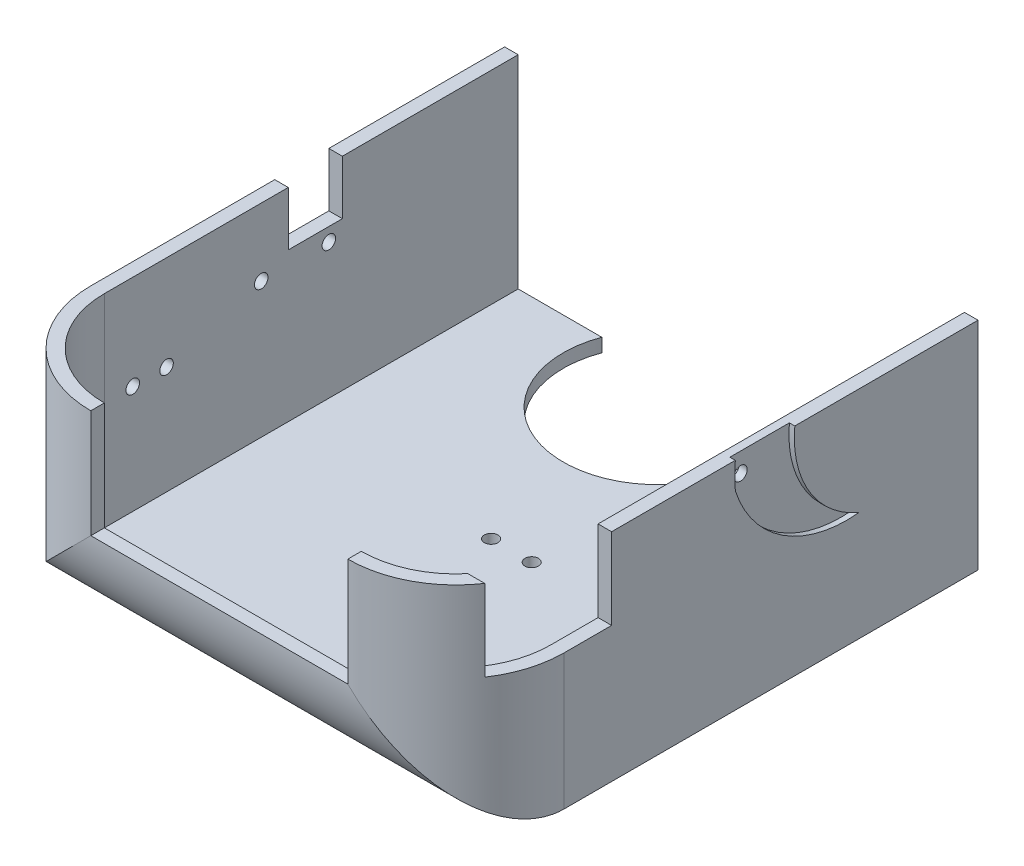
ISO-10303-21;
HEADER;
FILE_DESCRIPTION(('STEP AP214'),'2;1');
FILE_NAME('part.step','',(''),(''),'','','');
FILE_SCHEMA(('AUTOMOTIVE_DESIGN { 1 0 10303 214 1 1 1 1 }'));
ENDSEC;
DATA;
#1=APPLICATION_CONTEXT('core data for automotive mechanical design processes');
#2=APPLICATION_PROTOCOL_DEFINITION('international standard','automotive_design',2000,#1);
#3=PRODUCT_CONTEXT('',#1,'mechanical');
#4=PRODUCT('Part','Part','',(#3));
#5=PRODUCT_RELATED_PRODUCT_CATEGORY('part','',(#4));
#6=PRODUCT_DEFINITION_FORMATION('','',#4);
#7=PRODUCT_DEFINITION_CONTEXT('part definition',#1,'design');
#8=PRODUCT_DEFINITION('design','',#6,#7);
#9=PRODUCT_DEFINITION_SHAPE('','',#8);
#10=(LENGTH_UNIT() NAMED_UNIT(*) SI_UNIT(.MILLI.,.METRE.));
#11=(NAMED_UNIT(*) PLANE_ANGLE_UNIT() SI_UNIT($,.RADIAN.));
#12=(NAMED_UNIT(*) SI_UNIT($,.STERADIAN.) SOLID_ANGLE_UNIT());
#13=UNCERTAINTY_MEASURE_WITH_UNIT(LENGTH_MEASURE(1.E-05),#10,'distance_accuracy_value','');
#14=(GEOMETRIC_REPRESENTATION_CONTEXT(3) GLOBAL_UNCERTAINTY_ASSIGNED_CONTEXT((#13)) GLOBAL_UNIT_ASSIGNED_CONTEXT((#10,
#11,#12)) REPRESENTATION_CONTEXT('',''));
#15=CARTESIAN_POINT('',(0.,0.,0.));
#16=DIRECTION('',(0.,0.,1.));
#17=DIRECTION('',(1.,0.,0.));
#18=AXIS2_PLACEMENT_3D('',#15,#16,#17);
#19=CARTESIAN_POINT('',(0.,0.,0.));
#20=DIRECTION('',(0.,1.,0.));
#21=DIRECTION('',(0.,0.,1.));
#22=AXIS2_PLACEMENT_3D('',#19,#20,#21);
#23=PLANE('',#22);
#24=DIRECTION('',(-1.,0.,0.));
#25=VECTOR('',#24,1.);
#26=CARTESIAN_POINT('',(-82.5,0.,65.));
#27=LINE('',#26,#25);
#28=CARTESIAN_POINT('',(-82.5,0.,65.));
#29=VERTEX_POINT('',#28);
#30=CARTESIAN_POINT('',(-87.5,0.,65.));
#31=VERTEX_POINT('',#30);
#32=EDGE_CURVE('E289',#29,#31,#27,.T.);
#33=ORIENTED_EDGE('',*,*,#32,.F.);
#34=DIRECTION('',(0.,0.,1.));
#35=VECTOR('',#34,1.);
#36=CARTESIAN_POINT('',(-82.5,0.,193.));
#37=LINE('',#36,#35);
#38=CARTESIAN_POINT('',(-82.5,0.,0.));
#39=VERTEX_POINT('',#38);
#40=EDGE_CURVE('E355',#39,#29,#37,.T.);
#41=ORIENTED_EDGE('',*,*,#40,.F.);
#42=DIRECTION('',(-1.,0.,0.));
#43=VECTOR('',#42,1.);
#44=CARTESIAN_POINT('',(110.,0.,0.));
#45=LINE('',#44,#43);
#46=CARTESIAN_POINT('',(-87.5,0.,0.));
#47=VERTEX_POINT('',#46);
#48=EDGE_CURVE('E322',#39,#47,#45,.T.);
#49=ORIENTED_EDGE('',*,*,#48,.T.);
#50=DIRECTION('',(0.,0.,1.));
#51=VECTOR('',#50,1.);
#52=CARTESIAN_POINT('',(-87.5,0.,193.));
#53=LINE('',#52,#51);
#54=EDGE_CURVE('E362',#47,#31,#53,.T.);
#55=ORIENTED_EDGE('',*,*,#54,.T.);
#56=EDGE_LOOP('',(#33,#41,#49,#55));
#57=FACE_BOUND('',#56,.T.);
#58=ADVANCED_FACE('F45',(#57),#23,.T.);
#59=CARTESIAN_POINT('',(0.,0.,0.));
#60=DIRECTION('',(0.,0.,-1.));
#61=DIRECTION('',(-1.,0.,0.));
#62=AXIS2_PLACEMENT_3D('',#59,#60,#61);
#63=PLANE('',#62);
#64=DIRECTION('',(0.,-1.,0.));
#65=VECTOR('',#64,1.);
#66=CARTESIAN_POINT('',(-87.5,-80.,0.));
#67=LINE('',#66,#65);
#68=CARTESIAN_POINT('',(-87.5,-80.,0.));
#69=VERTEX_POINT('',#68);
#70=EDGE_CURVE('E434',#47,#69,#67,.T.);
#71=ORIENTED_EDGE('',*,*,#70,.F.);
#72=ORIENTED_EDGE('',*,*,#48,.F.);
#73=DIRECTION('',(0.,-1.,0.));
#74=VECTOR('',#73,1.);
#75=CARTESIAN_POINT('',(-82.5,0.,0.));
#76=LINE('',#75,#74);
#77=CARTESIAN_POINT('',(-82.5,-75.,0.));
#78=VERTEX_POINT('',#77);
#79=EDGE_CURVE('E426',#39,#78,#76,.T.);
#80=ORIENTED_EDGE('',*,*,#79,.T.);
#81=DIRECTION('',(1.,0.,0.));
#82=VECTOR('',#81,1.);
#83=CARTESIAN_POINT('',(0.,-75.,0.));
#84=LINE('',#83,#82);
#85=CARTESIAN_POINT('',(-51.5907616385491,-75.,0.));
#86=VERTEX_POINT('',#85);
#87=EDGE_CURVE('E403',#78,#86,#84,.T.);
#88=ORIENTED_EDGE('',*,*,#87,.T.);
#89=DIRECTION('',(0.,1.,0.));
#90=VECTOR('',#89,1.);
#91=CARTESIAN_POINT('',(-51.5907616385491,-80.,0.));
#92=LINE('',#91,#90);
#93=CARTESIAN_POINT('',(-51.5907616385491,-80.,0.));
#94=VERTEX_POINT('',#93);
#95=EDGE_CURVE('E387',#94,#86,#92,.T.);
#96=ORIENTED_EDGE('',*,*,#95,.F.);
#97=DIRECTION('',(1.,0.,0.));
#98=VECTOR('',#97,1.);
#99=CARTESIAN_POINT('',(-87.5,-80.,0.));
#100=LINE('',#99,#98);
#101=EDGE_CURVE('E438',#69,#94,#100,.T.);
#102=ORIENTED_EDGE('',*,*,#101,.F.);
#103=EDGE_LOOP('',(#71,#72,#80,#88,#96,#102));
#104=FACE_BOUND('',#103,.T.);
#105=ADVANCED_FACE('F565',(#104),#63,.T.);
#106=DIRECTION('',(0.,1.,0.));
#107=VECTOR('',#106,1.);
#108=CARTESIAN_POINT('',(82.5,0.,0.));
#109=LINE('',#108,#107);
#110=CARTESIAN_POINT('',(82.5,-75.,0.));
#111=VERTEX_POINT('',#110);
#112=CARTESIAN_POINT('',(82.5,0.,0.));
#113=VERTEX_POINT('',#112);
#114=EDGE_CURVE('E415',#111,#113,#109,.T.);
#115=ORIENTED_EDGE('',*,*,#114,.T.);
#116=CARTESIAN_POINT('',(87.5,0.,0.));
#117=VERTEX_POINT('',#116);
#118=EDGE_CURVE('E332',#117,#113,#45,.T.);
#119=ORIENTED_EDGE('',*,*,#118,.F.);
#120=DIRECTION('',(0.,1.,0.));
#121=VECTOR('',#120,1.);
#122=CARTESIAN_POINT('',(87.5,-80.,0.));
#123=LINE('',#122,#121);
#124=CARTESIAN_POINT('',(87.5,-80.,0.));
#125=VERTEX_POINT('',#124);
#126=EDGE_CURVE('E431',#125,#117,#123,.T.);
#127=ORIENTED_EDGE('',*,*,#126,.F.);
#128=CARTESIAN_POINT('',(14.0907616385492,-80.,0.));
#129=VERTEX_POINT('',#128);
#130=EDGE_CURVE('E437',#129,#125,#100,.T.);
#131=ORIENTED_EDGE('',*,*,#130,.F.);
#132=DIRECTION('',(0.,1.,0.));
#133=VECTOR('',#132,1.);
#134=CARTESIAN_POINT('',(14.0907616385492,-80.,0.));
#135=LINE('',#134,#133);
#136=CARTESIAN_POINT('',(14.0907616385492,-75.,0.));
#137=VERTEX_POINT('',#136);
#138=EDGE_CURVE('E385',#137,#129,#135,.F.);
#139=ORIENTED_EDGE('',*,*,#138,.F.);
#140=EDGE_CURVE('E429',#137,#111,#84,.T.);
#141=ORIENTED_EDGE('',*,*,#140,.T.);
#142=EDGE_LOOP('',(#115,#119,#127,#131,#139,#141));
#143=FACE_BOUND('',#142,.T.);
#144=ADVANCED_FACE('F513',(#143),#63,.T.);
#145=CARTESIAN_POINT('',(87.5,-80.,193.));
#146=DIRECTION('',(-1.,0.,0.));
#147=DIRECTION('',(0.,0.,1.));
#148=AXIS2_PLACEMENT_3D('',#145,#146,#147);
#149=PLANE('',#148);
#150=DIRECTION('',(0.,-0.999454897098666,-0.0330137647882723));
#151=VECTOR('',#150,1.);
#152=CARTESIAN_POINT('',(87.5,-4.77150670641982,89.8939941807223));
#153=LINE('',#152,#151);
#154=CARTESIAN_POINT('',(87.5,-4.77150670641982,89.8939941807223));
#155=VERTEX_POINT('',#154);
#156=CARTESIAN_POINT('',(87.5,-9.7715067064198,89.7288353282113));
#157=VERTEX_POINT('',#156);
#158=EDGE_CURVE('E258',#155,#157,#153,.T.);
#159=ORIENTED_EDGE('',*,*,#158,.F.);
#160=DIRECTION('',(0.,-0.999401488348817,0.0345928473267034));
#161=VECTOR('',#160,1.);
#162=CARTESIAN_POINT('',(87.5,0.,89.7288353282113));
#163=LINE('',#162,#161);
#164=CARTESIAN_POINT('',(87.5,0.,89.7288353282113));
#165=VERTEX_POINT('',#164);
#166=EDGE_CURVE('E230',#165,#155,#163,.T.);
#167=ORIENTED_EDGE('',*,*,#166,.F.);
#168=DIRECTION('',(0.,0.,-1.));
#169=VECTOR('',#168,1.);
#170=CARTESIAN_POINT('',(87.5,0.,193.));
#171=LINE('',#170,#169);
#172=CARTESIAN_POINT('',(87.5,0.,135.457670656423));
#173=VERTEX_POINT('',#172);
#174=EDGE_CURVE('E346',#173,#165,#171,.T.);
#175=ORIENTED_EDGE('',*,*,#174,.F.);
#176=DIRECTION('',(0.,-1.,0.));
#177=VECTOR('',#176,1.);
#178=CARTESIAN_POINT('',(87.5,-80.,135.457670656423));
#179=LINE('',#178,#177);
#180=CARTESIAN_POINT('',(87.5,-30.,135.457670656423));
#181=VERTEX_POINT('',#180);
#182=EDGE_CURVE('E380',#173,#181,#179,.T.);
#183=ORIENTED_EDGE('',*,*,#182,.T.);
#184=DIRECTION('',(0.,0.,1.));
#185=VECTOR('',#184,1.);
#186=CARTESIAN_POINT('',(87.5,-30.,193.));
#187=LINE('',#186,#185);
#188=CARTESIAN_POINT('',(87.5,-30.,153.));
#189=VERTEX_POINT('',#188);
#190=EDGE_CURVE('E375',#181,#189,#187,.T.);
#191=ORIENTED_EDGE('',*,*,#190,.T.);
#192=DIRECTION('',(0.,1.,0.));
#193=VECTOR('',#192,1.);
#194=CARTESIAN_POINT('',(87.5,-80.,153.));
#195=LINE('',#194,#193);
#196=CARTESIAN_POINT('',(87.5,-80.,153.));
#197=VERTEX_POINT('',#196);
#198=EDGE_CURVE('E458',#189,#197,#195,.F.);
#199=ORIENTED_EDGE('',*,*,#198,.T.);
#200=DIRECTION('',(0.,0.,-1.));
#201=VECTOR('',#200,1.);
#202=CARTESIAN_POINT('',(87.5,-80.,193.));
#203=LINE('',#202,#201);
#204=EDGE_CURVE('E441',#197,#125,#203,.T.);
#205=ORIENTED_EDGE('',*,*,#204,.T.);
#206=ORIENTED_EDGE('',*,*,#126,.T.);
#207=CARTESIAN_POINT('',(87.5,0.,67.7288353282113));
#208=VERTEX_POINT('',#207);
#209=EDGE_CURVE('E345',#208,#117,#171,.T.);
#210=ORIENTED_EDGE('',*,*,#209,.F.);
#211=CARTESIAN_POINT('',(87.5,-3.71907040689845,29.0884792625893));
#212=DIRECTION('',(-1.,0.,0.));
#213=DIRECTION('',(0.,0.,-1.));
#214=AXIS2_PLACEMENT_3D('',#211,#212,#213);
#215=CIRCLE('',#214,38.8189206646645);
#216=CARTESIAN_POINT('',(87.5,-39.5692118956316,43.977265539762));
#217=VERTEX_POINT('',#216);
#218=EDGE_CURVE('E246',#217,#208,#215,.T.);
#219=ORIENTED_EDGE('',*,*,#218,.F.);
#220=CARTESIAN_POINT('',(87.5,3.43317957033893,48.5493950635888));
#221=DIRECTION('',(1.,0.,0.));
#222=DIRECTION('',(0.,0.,-1.));
#223=AXIS2_PLACEMENT_3D('',#220,#221,#222);
#224=CIRCLE('',#223,43.2447689342333);
#225=EDGE_CURVE('E248',#157,#217,#224,.T.);
#226=ORIENTED_EDGE('',*,*,#225,.F.);
#227=EDGE_LOOP('',(#159,#167,#175,#183,#191,#199,#205,#206,#210,#219,#226));
#228=FACE_BOUND('',#227,.T.);
#229=ADVANCED_FACE('F506',(#228),#149,.F.);
#230=CARTESIAN_POINT('',(-87.5,-80.,193.));
#231=DIRECTION('',(1.,0.,0.));
#232=DIRECTION('',(0.,0.,-1.));
#233=AXIS2_PLACEMENT_3D('',#230,#231,#232);
#234=PLANE('',#233);
#235=CARTESIAN_POINT('',(-87.5,-35.,130.));
#236=DIRECTION('',(-1.,0.,0.));
#237=DIRECTION('',(0.,0.,1.));
#238=AXIS2_PLACEMENT_3D('',#235,#236,#237);
#239=CIRCLE('',#238,2.5);
#240=CARTESIAN_POINT('',(-87.5,-35.,132.5));
#241=VERTEX_POINT('',#240);
#242=EDGE_CURVE('E285',#241,#241,#239,.T.);
#243=ORIENTED_EDGE('',*,*,#242,.F.);
#244=EDGE_LOOP('',(#243));
#245=FACE_BOUND('',#244,.T.);
#246=CARTESIAN_POINT('',(-87.5,-35.,142.5));
#247=DIRECTION('',(-1.,0.,0.));
#248=DIRECTION('',(0.,0.,1.));
#249=AXIS2_PLACEMENT_3D('',#246,#247,#248);
#250=CIRCLE('',#249,2.5);
#251=CARTESIAN_POINT('',(-87.5,-35.,145.));
#252=VERTEX_POINT('',#251);
#253=EDGE_CURVE('E302',#252,#252,#250,.T.);
#254=ORIENTED_EDGE('',*,*,#253,.F.);
#255=EDGE_LOOP('',(#254));
#256=FACE_BOUND('',#255,.T.);
#257=CARTESIAN_POINT('',(-87.5,-25.,70.));
#258=DIRECTION('',(-1.,0.,0.));
#259=DIRECTION('',(0.,0.,1.));
#260=AXIS2_PLACEMENT_3D('',#257,#258,#259);
#261=CIRCLE('',#260,2.5);
#262=CARTESIAN_POINT('',(-87.5,-25.,72.5));
#263=VERTEX_POINT('',#262);
#264=EDGE_CURVE('E308',#263,#263,#261,.T.);
#265=ORIENTED_EDGE('',*,*,#264,.F.);
#266=EDGE_LOOP('',(#265));
#267=FACE_BOUND('',#266,.T.);
#268=CARTESIAN_POINT('',(-87.5,-25.,95.));
#269=DIRECTION('',(-1.,0.,0.));
#270=DIRECTION('',(0.,0.,1.));
#271=AXIS2_PLACEMENT_3D('',#268,#269,#270);
#272=CIRCLE('',#271,2.5);
#273=CARTESIAN_POINT('',(-87.5,-25.,97.5));
#274=VERTEX_POINT('',#273);
#275=EDGE_CURVE('E314',#274,#274,#272,.T.);
#276=ORIENTED_EDGE('',*,*,#275,.F.);
#277=EDGE_LOOP('',(#276));
#278=FACE_BOUND('',#277,.T.);
#279=DIRECTION('',(0.,0.,1.));
#280=VECTOR('',#279,1.);
#281=CARTESIAN_POINT('',(-87.5,-20.,65.));
#282=LINE('',#281,#280);
#283=CARTESIAN_POINT('',(-87.5,-20.,65.));
#284=VERTEX_POINT('',#283);
#285=CARTESIAN_POINT('',(-87.5,-20.,85.));
#286=VERTEX_POINT('',#285);
#287=EDGE_CURVE('E284',#284,#286,#282,.T.);
#288=ORIENTED_EDGE('',*,*,#287,.F.);
#289=DIRECTION('',(0.,-1.,0.));
#290=VECTOR('',#289,1.);
#291=CARTESIAN_POINT('',(-87.5,0.,65.));
#292=LINE('',#291,#290);
#293=EDGE_CURVE('E281',#31,#284,#292,.T.);
#294=ORIENTED_EDGE('',*,*,#293,.F.);
#295=ORIENTED_EDGE('',*,*,#54,.F.);
#296=ORIENTED_EDGE('',*,*,#70,.T.);
#297=DIRECTION('',(0.,0.,-1.));
#298=VECTOR('',#297,1.);
#299=CARTESIAN_POINT('',(-87.5,-80.,193.));
#300=LINE('',#299,#298);
#301=CARTESIAN_POINT('',(-87.5,-80.,153.));
#302=VERTEX_POINT('',#301);
#303=EDGE_CURVE('E444',#302,#69,#300,.T.);
#304=ORIENTED_EDGE('',*,*,#303,.F.);
#305=DIRECTION('',(0.,-1.,0.));
#306=VECTOR('',#305,1.);
#307=CARTESIAN_POINT('',(-87.5,-80.,153.));
#308=LINE('',#307,#306);
#309=CARTESIAN_POINT('',(-87.5,0.,153.));
#310=VERTEX_POINT('',#309);
#311=EDGE_CURVE('E460',#302,#310,#308,.F.);
#312=ORIENTED_EDGE('',*,*,#311,.T.);
#313=CARTESIAN_POINT('',(-87.5,0.,85.));
#314=VERTEX_POINT('',#313);
#315=EDGE_CURVE('E361',#314,#310,#53,.T.);
#316=ORIENTED_EDGE('',*,*,#315,.F.);
#317=DIRECTION('',(0.,1.,0.));
#318=VECTOR('',#317,1.);
#319=CARTESIAN_POINT('',(-87.5,0.,85.));
#320=LINE('',#319,#318);
#321=EDGE_CURVE('E68',#286,#314,#320,.T.);
#322=ORIENTED_EDGE('',*,*,#321,.F.);
#323=EDGE_LOOP('',(#288,#294,#295,#296,#304,#312,#316,#322));
#324=FACE_BOUND('',#323,.T.);
#325=ADVANCED_FACE('F589',(#245,#256,#267,#278,#324),#234,.F.);
#326=CARTESIAN_POINT('',(-47.5,0.,153.));
#327=DIRECTION('',(0.,-1.,0.));
#328=DIRECTION('',(0.,0.,-1.));
#329=AXIS2_PLACEMENT_3D('',#326,#327,#328);
#330=CYLINDRICAL_SURFACE('',#329,40.);
#331=DIRECTION('',(0.,-1.,0.));
#332=VECTOR('',#331,1.);
#333=CARTESIAN_POINT('',(-47.5,0.,193.));
#334=LINE('',#333,#332);
#335=CARTESIAN_POINT('',(-47.5,0.,193.));
#336=VERTEX_POINT('',#335);
#337=CARTESIAN_POINT('',(-47.5,-40.,193.));
#338=VERTEX_POINT('',#337);
#339=EDGE_CURVE('E447',#336,#338,#334,.T.);
#340=ORIENTED_EDGE('',*,*,#339,.F.);
#341=CARTESIAN_POINT('',(-47.5,0.,153.));
#342=DIRECTION('',(0.,1.,0.));
#343=DIRECTION('',(0.,0.,1.));
#344=AXIS2_PLACEMENT_3D('',#341,#342,#343);
#345=CIRCLE('',#344,40.);
#346=EDGE_CURVE('E358',#336,#310,#345,.F.);
#347=ORIENTED_EDGE('',*,*,#346,.T.);
#348=ORIENTED_EDGE('',*,*,#311,.F.);
#349=CARTESIAN_POINT('',(-47.5,-40.,153.));
#350=DIRECTION('',(0.707106781186547,-0.707106781186547,0.));
#351=DIRECTION('',(-0.707106781186547,-0.707106781186547,0.));
#352=AXIS2_PLACEMENT_3D('',#349,#350,#351);
#353=ELLIPSE('',#352,56.5685424949238,40.);
#354=EDGE_CURVE('E435',#338,#302,#353,.T.);
#355=ORIENTED_EDGE('',*,*,#354,.F.);
#356=EDGE_LOOP('',(#340,#347,#348,#355));
#357=FACE_BOUND('',#356,.T.);
#358=ADVANCED_FACE('F47',(#357),#330,.T.);
#359=CARTESIAN_POINT('',(47.5,0.,153.));
#360=DIRECTION('',(0.,1.,0.));
#361=DIRECTION('',(0.,0.,1.));
#362=AXIS2_PLACEMENT_3D('',#359,#360,#361);
#363=CYLINDRICAL_SURFACE('',#362,40.);
#364=DIRECTION('',(0.,1.,0.));
#365=VECTOR('',#364,1.);
#366=CARTESIAN_POINT('',(80.6006499737944,0.,175.457670656423));
#367=LINE('',#366,#365);
#368=CARTESIAN_POINT('',(80.6006499737944,0.,175.457670656423));
#369=VERTEX_POINT('',#368);
#370=CARTESIAN_POINT('',(80.6006499737944,-30.,175.457670656423));
#371=VERTEX_POINT('',#370);
#372=EDGE_CURVE('E378',#369,#371,#367,.F.);
#373=ORIENTED_EDGE('',*,*,#372,.F.);
#374=CARTESIAN_POINT('',(47.5,0.,153.));
#375=DIRECTION('',(0.,1.,0.));
#376=DIRECTION('',(0.,0.,1.));
#377=AXIS2_PLACEMENT_3D('',#374,#375,#376);
#378=CIRCLE('',#377,40.);
#379=CARTESIAN_POINT('',(47.5,0.,193.));
#380=VERTEX_POINT('',#379);
#381=EDGE_CURVE('E335',#369,#380,#378,.F.);
#382=ORIENTED_EDGE('',*,*,#381,.T.);
#383=DIRECTION('',(0.,1.,0.));
#384=VECTOR('',#383,1.);
#385=CARTESIAN_POINT('',(47.5,0.,193.));
#386=LINE('',#385,#384);
#387=CARTESIAN_POINT('',(47.5,-40.,193.));
#388=VERTEX_POINT('',#387);
#389=EDGE_CURVE('E449',#388,#380,#386,.T.);
#390=ORIENTED_EDGE('',*,*,#389,.F.);
#391=CARTESIAN_POINT('',(47.5,-40.,153.));
#392=DIRECTION('',(0.707106781186547,0.707106781186547,0.));
#393=DIRECTION('',(-0.707106781186547,0.707106781186547,0.));
#394=AXIS2_PLACEMENT_3D('',#391,#392,#393);
#395=ELLIPSE('',#394,56.5685424949238,40.);
#396=EDGE_CURVE('E409',#197,#388,#395,.F.);
#397=ORIENTED_EDGE('',*,*,#396,.F.);
#398=ORIENTED_EDGE('',*,*,#198,.F.);
#399=CARTESIAN_POINT('',(47.5,-30.,153.));
#400=DIRECTION('',(0.,-1.,0.));
#401=DIRECTION('',(0.,0.,-1.));
#402=AXIS2_PLACEMENT_3D('',#399,#400,#401);
#403=CIRCLE('',#402,40.);
#404=EDGE_CURVE('E373',#371,#189,#403,.F.);
#405=ORIENTED_EDGE('',*,*,#404,.F.);
#406=EDGE_LOOP('',(#373,#382,#390,#397,#398,#405));
#407=FACE_BOUND('',#406,.T.);
#408=ADVANCED_FACE('F501',(#407),#363,.T.);
#409=CARTESIAN_POINT('',(82.5,-80.,193.));
#410=DIRECTION('',(-1.,0.,0.));
#411=DIRECTION('',(0.,0.,1.));
#412=AXIS2_PLACEMENT_3D('',#409,#410,#411);
#413=PLANE('',#412);
#414=CARTESIAN_POINT('',(82.5,-7.13937962441099,85.8114147544668));
#415=DIRECTION('',(-1.,0.,0.));
#416=DIRECTION('',(0.,0.,1.));
#417=AXIS2_PLACEMENT_3D('',#414,#415,#416);
#418=CIRCLE('',#417,2.5);
#419=CARTESIAN_POINT('',(82.5,-7.13937962441099,88.3114147544668));
#420=VERTEX_POINT('',#419);
#421=EDGE_CURVE('E251',#420,#420,#418,.T.);
#422=ORIENTED_EDGE('',*,*,#421,.F.);
#423=EDGE_LOOP('',(#422));
#424=FACE_BOUND('',#423,.T.);
#425=DIRECTION('',(0.,-1.,0.));
#426=VECTOR('',#425,1.);
#427=CARTESIAN_POINT('',(82.5,-80.,135.457670656423));
#428=LINE('',#427,#426);
#429=CARTESIAN_POINT('',(82.5,0.,135.457670656423));
#430=VERTEX_POINT('',#429);
#431=CARTESIAN_POINT('',(82.5,-30.,135.457670656423));
#432=VERTEX_POINT('',#431);
#433=EDGE_CURVE('E53',#430,#432,#428,.T.);
#434=ORIENTED_EDGE('',*,*,#433,.F.);
#435=DIRECTION('',(0.,0.,-1.));
#436=VECTOR('',#435,1.);
#437=CARTESIAN_POINT('',(82.5,0.,193.));
#438=LINE('',#437,#436);
#439=EDGE_CURVE('E342',#430,#113,#438,.T.);
#440=ORIENTED_EDGE('',*,*,#439,.T.);
#441=ORIENTED_EDGE('',*,*,#114,.F.);
#442=DIRECTION('',(0.,0.,-1.));
#443=VECTOR('',#442,1.);
#444=CARTESIAN_POINT('',(82.5,-75.,193.));
#445=LINE('',#444,#443);
#446=CARTESIAN_POINT('',(82.5,-75.,153.));
#447=VERTEX_POINT('',#446);
#448=EDGE_CURVE('E399',#447,#111,#445,.T.);
#449=ORIENTED_EDGE('',*,*,#448,.F.);
#450=DIRECTION('',(0.,1.,0.));
#451=VECTOR('',#450,1.);
#452=CARTESIAN_POINT('',(82.5,-80.,153.));
#453=LINE('',#452,#451);
#454=CARTESIAN_POINT('',(82.5,-30.,153.));
#455=VERTEX_POINT('',#454);
#456=EDGE_CURVE('E395',#455,#447,#453,.F.);
#457=ORIENTED_EDGE('',*,*,#456,.F.);
#458=DIRECTION('',(0.,0.,1.));
#459=VECTOR('',#458,1.);
#460=CARTESIAN_POINT('',(82.5,-30.,193.));
#461=LINE('',#460,#459);
#462=EDGE_CURVE('E369',#432,#455,#461,.T.);
#463=ORIENTED_EDGE('',*,*,#462,.F.);
#464=EDGE_LOOP('',(#434,#440,#441,#449,#457,#463));
#465=FACE_BOUND('',#464,.T.);
#466=ADVANCED_FACE('F485',(#424,#465),#413,.T.);
#467=CARTESIAN_POINT('',(-82.5,-80.,193.));
#468=DIRECTION('',(1.,0.,0.));
#469=DIRECTION('',(0.,0.,-1.));
#470=AXIS2_PLACEMENT_3D('',#467,#468,#469);
#471=PLANE('',#470);
#472=DIRECTION('',(0.,-1.,0.));
#473=VECTOR('',#472,1.);
#474=CARTESIAN_POINT('',(-82.5,0.,65.));
#475=LINE('',#474,#473);
#476=CARTESIAN_POINT('',(-82.5,-20.,65.));
#477=VERTEX_POINT('',#476);
#478=EDGE_CURVE('E271',#29,#477,#475,.T.);
#479=ORIENTED_EDGE('',*,*,#478,.T.);
#480=DIRECTION('',(0.,0.,1.));
#481=VECTOR('',#480,1.);
#482=CARTESIAN_POINT('',(-82.5,-20.,65.));
#483=LINE('',#482,#481);
#484=CARTESIAN_POINT('',(-82.5,-20.,85.));
#485=VERTEX_POINT('',#484);
#486=EDGE_CURVE('E274',#477,#485,#483,.T.);
#487=ORIENTED_EDGE('',*,*,#486,.T.);
#488=DIRECTION('',(0.,1.,0.));
#489=VECTOR('',#488,1.);
#490=CARTESIAN_POINT('',(-82.5,0.,85.));
#491=LINE('',#490,#489);
#492=CARTESIAN_POINT('',(-82.5,0.,85.));
#493=VERTEX_POINT('',#492);
#494=EDGE_CURVE('E277',#485,#493,#491,.T.);
#495=ORIENTED_EDGE('',*,*,#494,.T.);
#496=CARTESIAN_POINT('',(-82.5,0.,153.));
#497=VERTEX_POINT('',#496);
#498=EDGE_CURVE('E354',#493,#497,#37,.T.);
#499=ORIENTED_EDGE('',*,*,#498,.T.);
#500=DIRECTION('',(0.,1.,0.));
#501=VECTOR('',#500,1.);
#502=CARTESIAN_POINT('',(-82.5,-80.,153.));
#503=LINE('',#502,#501);
#504=CARTESIAN_POINT('',(-82.5,-75.,153.));
#505=VERTEX_POINT('',#504);
#506=EDGE_CURVE('E397',#505,#497,#503,.T.);
#507=ORIENTED_EDGE('',*,*,#506,.F.);
#508=DIRECTION('',(0.,0.,-1.));
#509=VECTOR('',#508,1.);
#510=CARTESIAN_POINT('',(-82.5,-75.,193.));
#511=LINE('',#510,#509);
#512=EDGE_CURVE('E402',#505,#78,#511,.T.);
#513=ORIENTED_EDGE('',*,*,#512,.T.);
#514=ORIENTED_EDGE('',*,*,#79,.F.);
#515=ORIENTED_EDGE('',*,*,#40,.T.);
#516=EDGE_LOOP('',(#479,#487,#495,#499,#507,#513,#514,#515));
#517=FACE_BOUND('',#516,.T.);
#518=CARTESIAN_POINT('',(-82.5,-35.,130.));
#519=DIRECTION('',(-1.,0.,0.));
#520=DIRECTION('',(0.,0.,1.));
#521=AXIS2_PLACEMENT_3D('',#518,#519,#520);
#522=CIRCLE('',#521,2.5);
#523=CARTESIAN_POINT('',(-82.5,-35.,132.5));
#524=VERTEX_POINT('',#523);
#525=EDGE_CURVE('E299',#524,#524,#522,.T.);
#526=ORIENTED_EDGE('',*,*,#525,.T.);
#527=EDGE_LOOP('',(#526));
#528=FACE_BOUND('',#527,.T.);
#529=CARTESIAN_POINT('',(-82.5,-35.,142.5));
#530=DIRECTION('',(-1.,0.,0.));
#531=DIRECTION('',(0.,0.,1.));
#532=AXIS2_PLACEMENT_3D('',#529,#530,#531);
#533=CIRCLE('',#532,2.5);
#534=CARTESIAN_POINT('',(-82.5,-35.,145.));
#535=VERTEX_POINT('',#534);
#536=EDGE_CURVE('E305',#535,#535,#533,.T.);
#537=ORIENTED_EDGE('',*,*,#536,.T.);
#538=EDGE_LOOP('',(#537));
#539=FACE_BOUND('',#538,.T.);
#540=CARTESIAN_POINT('',(-82.5,-25.,70.));
#541=DIRECTION('',(-1.,0.,0.));
#542=DIRECTION('',(0.,0.,1.));
#543=AXIS2_PLACEMENT_3D('',#540,#541,#542);
#544=CIRCLE('',#543,2.5);
#545=CARTESIAN_POINT('',(-82.5,-25.,72.5));
#546=VERTEX_POINT('',#545);
#547=EDGE_CURVE('E311',#546,#546,#544,.T.);
#548=ORIENTED_EDGE('',*,*,#547,.T.);
#549=EDGE_LOOP('',(#548));
#550=FACE_BOUND('',#549,.T.);
#551=CARTESIAN_POINT('',(-82.5,-25.,95.));
#552=DIRECTION('',(-1.,0.,0.));
#553=DIRECTION('',(0.,0.,1.));
#554=AXIS2_PLACEMENT_3D('',#551,#552,#553);
#555=CIRCLE('',#554,2.5);
#556=CARTESIAN_POINT('',(-82.5,-25.,97.5));
#557=VERTEX_POINT('',#556);
#558=EDGE_CURVE('E264',#557,#557,#555,.T.);
#559=ORIENTED_EDGE('',*,*,#558,.T.);
#560=EDGE_LOOP('',(#559));
#561=FACE_BOUND('',#560,.T.);
#562=ADVANCED_FACE('F581',(#517,#528,#539,#550,#561),#471,.T.);
#563=CARTESIAN_POINT('',(-47.5,0.,153.));
#564=DIRECTION('',(0.,-1.,0.));
#565=DIRECTION('',(0.,0.,-1.));
#566=AXIS2_PLACEMENT_3D('',#563,#564,#565);
#567=CYLINDRICAL_SURFACE('',#566,35.);
#568=CARTESIAN_POINT('',(-47.5,0.,153.));
#569=DIRECTION('',(0.,1.,0.));
#570=DIRECTION('',(0.,0.,1.));
#571=AXIS2_PLACEMENT_3D('',#568,#569,#570);
#572=CIRCLE('',#571,35.);
#573=CARTESIAN_POINT('',(-47.5,0.,188.));
#574=VERTEX_POINT('',#573);
#575=EDGE_CURVE('E351',#574,#497,#572,.F.);
#576=ORIENTED_EDGE('',*,*,#575,.F.);
#577=DIRECTION('',(0.,1.,0.));
#578=VECTOR('',#577,1.);
#579=CARTESIAN_POINT('',(-47.5,0.,188.));
#580=LINE('',#579,#578);
#581=CARTESIAN_POINT('',(-47.5,-40.,188.));
#582=VERTEX_POINT('',#581);
#583=EDGE_CURVE('E406',#574,#582,#580,.F.);
#584=ORIENTED_EDGE('',*,*,#583,.T.);
#585=CARTESIAN_POINT('',(-47.5,-40.,153.));
#586=DIRECTION('',(0.707106781186547,-0.707106781186547,0.));
#587=DIRECTION('',(0.707106781186547,0.707106781186547,0.));
#588=AXIS2_PLACEMENT_3D('',#585,#586,#587);
#589=ELLIPSE('',#588,49.4974746830583,35.);
#590=EDGE_CURVE('E413',#582,#505,#589,.T.);
#591=ORIENTED_EDGE('',*,*,#590,.T.);
#592=ORIENTED_EDGE('',*,*,#506,.T.);
#593=EDGE_LOOP('',(#576,#584,#591,#592));
#594=FACE_BOUND('',#593,.T.);
#595=ADVANCED_FACE('F600',(#594),#567,.F.);
#596=CARTESIAN_POINT('',(47.5,0.,153.));
#597=DIRECTION('',(0.,1.,0.));
#598=DIRECTION('',(0.,0.,1.));
#599=AXIS2_PLACEMENT_3D('',#596,#597,#598);
#600=CYLINDRICAL_SURFACE('',#599,35.);
#601=CARTESIAN_POINT('',(47.5,0.,153.));
#602=DIRECTION('',(0.,1.,0.));
#603=DIRECTION('',(0.,0.,1.));
#604=AXIS2_PLACEMENT_3D('',#601,#602,#603);
#605=CIRCLE('',#604,35.);
#606=CARTESIAN_POINT('',(74.3449814432355,0.,175.457670656423));
#607=VERTEX_POINT('',#606);
#608=CARTESIAN_POINT('',(47.5,0.,188.));
#609=VERTEX_POINT('',#608);
#610=EDGE_CURVE('E333',#607,#609,#605,.F.);
#611=ORIENTED_EDGE('',*,*,#610,.F.);
#612=DIRECTION('',(0.,1.,0.));
#613=VECTOR('',#612,1.);
#614=CARTESIAN_POINT('',(74.3449814432355,0.,175.457670656423));
#615=LINE('',#614,#613);
#616=CARTESIAN_POINT('',(74.3449814432355,-30.,175.457670656423));
#617=VERTEX_POINT('',#616);
#618=EDGE_CURVE('E471',#607,#617,#615,.F.);
#619=ORIENTED_EDGE('',*,*,#618,.T.);
#620=CARTESIAN_POINT('',(47.5,-30.,153.));
#621=DIRECTION('',(0.,-1.,0.));
#622=DIRECTION('',(0.,0.,-1.));
#623=AXIS2_PLACEMENT_3D('',#620,#621,#622);
#624=CIRCLE('',#623,35.);
#625=EDGE_CURVE('E468',#617,#455,#624,.F.);
#626=ORIENTED_EDGE('',*,*,#625,.T.);
#627=ORIENTED_EDGE('',*,*,#456,.T.);
#628=CARTESIAN_POINT('',(47.5,-40.,153.));
#629=DIRECTION('',(0.707106781186547,0.707106781186547,0.));
#630=DIRECTION('',(0.707106781186547,-0.707106781186547,0.));
#631=AXIS2_PLACEMENT_3D('',#628,#629,#630);
#632=ELLIPSE('',#631,49.4974746830583,35.);
#633=CARTESIAN_POINT('',(47.5,-40.,188.));
#634=VERTEX_POINT('',#633);
#635=EDGE_CURVE('E392',#447,#634,#632,.F.);
#636=ORIENTED_EDGE('',*,*,#635,.T.);
#637=DIRECTION('',(0.,1.,0.));
#638=VECTOR('',#637,1.);
#639=CARTESIAN_POINT('',(47.5,0.,188.));
#640=LINE('',#639,#638);
#641=EDGE_CURVE('E417',#634,#609,#640,.T.);
#642=ORIENTED_EDGE('',*,*,#641,.T.);
#643=EDGE_LOOP('',(#611,#619,#626,#627,#636,#642));
#644=FACE_BOUND('',#643,.T.);
#645=ADVANCED_FACE('F491',(#644),#600,.F.);
#646=CARTESIAN_POINT('',(-47.5,40.,183.));
#647=DIRECTION('',(-1.,0.,0.));
#648=DIRECTION('',(0.,-1.,0.));
#649=AXIS2_PLACEMENT_3D('',#646,#647,#648);
#650=PLANE('',#649);
#651=DIRECTION('',(0.,0.,-1.));
#652=VECTOR('',#651,1.);
#653=CARTESIAN_POINT('',(-47.5,0.,183.));
#654=LINE('',#653,#652);
#655=EDGE_CURVE('E349',#336,#574,#654,.T.);
#656=ORIENTED_EDGE('',*,*,#655,.F.);
#657=ORIENTED_EDGE('',*,*,#339,.T.);
#658=DIRECTION('',(0.,0.,1.));
#659=VECTOR('',#658,1.);
#660=CARTESIAN_POINT('',(-47.5,-40.,183.));
#661=LINE('',#660,#659);
#662=EDGE_CURVE('E389',#582,#338,#661,.T.);
#663=ORIENTED_EDGE('',*,*,#662,.F.);
#664=ORIENTED_EDGE('',*,*,#583,.F.);
#665=EDGE_LOOP('',(#656,#657,#663,#664));
#666=FACE_BOUND('',#665,.T.);
#667=ADVANCED_FACE('F535',(#666),#650,.F.);
#668=CARTESIAN_POINT('',(47.5,40.,183.));
#669=DIRECTION('',(1.,0.,0.));
#670=DIRECTION('',(0.,1.,0.));
#671=AXIS2_PLACEMENT_3D('',#668,#669,#670);
#672=PLANE('',#671);
#673=DIRECTION('',(0.,0.,1.));
#674=VECTOR('',#673,1.);
#675=CARTESIAN_POINT('',(47.5,0.,183.));
#676=LINE('',#675,#674);
#677=EDGE_CURVE('E338',#609,#380,#676,.T.);
#678=ORIENTED_EDGE('',*,*,#677,.F.);
#679=ORIENTED_EDGE('',*,*,#641,.F.);
#680=DIRECTION('',(0.,0.,1.));
#681=VECTOR('',#680,1.);
#682=CARTESIAN_POINT('',(47.5,-40.,183.));
#683=LINE('',#682,#681);
#684=EDGE_CURVE('E390',#634,#388,#683,.T.);
#685=ORIENTED_EDGE('',*,*,#684,.T.);
#686=ORIENTED_EDGE('',*,*,#389,.T.);
#687=EDGE_LOOP('',(#678,#679,#685,#686));
#688=FACE_BOUND('',#687,.T.);
#689=ADVANCED_FACE('F545',(#688),#672,.F.);
#690=CARTESIAN_POINT('',(70.,-30.,135.457670656423));
#691=DIRECTION('',(0.,0.,-1.));
#692=DIRECTION('',(-1.,0.,0.));
#693=AXIS2_PLACEMENT_3D('',#690,#691,#692);
#694=PLANE('',#693);
#695=DIRECTION('',(1.,0.,0.));
#696=VECTOR('',#695,1.);
#697=CARTESIAN_POINT('',(70.,0.,135.457670656423));
#698=LINE('',#697,#696);
#699=EDGE_CURVE('E340',#430,#173,#698,.T.);
#700=ORIENTED_EDGE('',*,*,#699,.F.);
#701=ORIENTED_EDGE('',*,*,#433,.T.);
#702=DIRECTION('',(1.,0.,0.));
#703=VECTOR('',#702,1.);
#704=CARTESIAN_POINT('',(70.,-30.,135.457670656423));
#705=LINE('',#704,#703);
#706=EDGE_CURVE('E366',#432,#181,#705,.T.);
#707=ORIENTED_EDGE('',*,*,#706,.T.);
#708=ORIENTED_EDGE('',*,*,#182,.F.);
#709=EDGE_LOOP('',(#700,#701,#707,#708));
#710=FACE_BOUND('',#709,.T.);
#711=ADVANCED_FACE('F476',(#710),#694,.F.);
#712=CARTESIAN_POINT('',(70.,30.,175.457670656423));
#713=DIRECTION('',(0.,0.,1.));
#714=DIRECTION('',(1.,0.,0.));
#715=AXIS2_PLACEMENT_3D('',#712,#713,#714);
#716=PLANE('',#715);
#717=DIRECTION('',(-1.,0.,0.));
#718=VECTOR('',#717,1.);
#719=CARTESIAN_POINT('',(70.,0.,175.457670656423));
#720=LINE('',#719,#718);
#721=EDGE_CURVE('E12',#369,#607,#720,.T.);
#722=ORIENTED_EDGE('',*,*,#721,.F.);
#723=ORIENTED_EDGE('',*,*,#372,.T.);
#724=DIRECTION('',(1.,0.,0.));
#725=VECTOR('',#724,1.);
#726=CARTESIAN_POINT('',(70.,-30.,175.457670656423));
#727=LINE('',#726,#725);
#728=EDGE_CURVE('E365',#617,#371,#727,.T.);
#729=ORIENTED_EDGE('',*,*,#728,.F.);
#730=ORIENTED_EDGE('',*,*,#618,.F.);
#731=EDGE_LOOP('',(#722,#723,#729,#730));
#732=FACE_BOUND('',#731,.T.);
#733=ADVANCED_FACE('F498',(#732),#716,.F.);
#734=CARTESIAN_POINT('',(-87.5,-80.,193.));
#735=DIRECTION('',(0.,1.,0.));
#736=DIRECTION('',(0.,0.,1.));
#737=AXIS2_PLACEMENT_3D('',#734,#735,#736);
#738=PLANE('',#737);
#739=CARTESIAN_POINT('',(-7.49999999999999,-80.,85.));
#740=DIRECTION('',(0.,1.,0.));
#741=DIRECTION('',(0.,0.,1.));
#742=AXIS2_PLACEMENT_3D('',#739,#740,#741);
#743=CIRCLE('',#742,2.5);
#744=CARTESIAN_POINT('',(-7.49999999999999,-80.,87.5));
#745=VERTEX_POINT('',#744);
#746=EDGE_CURVE('E323',#745,#745,#743,.T.);
#747=ORIENTED_EDGE('',*,*,#746,.T.);
#748=EDGE_LOOP('',(#747));
#749=FACE_BOUND('',#748,.T.);
#750=CARTESIAN_POINT('',(7.50000000000001,-80.,85.));
#751=DIRECTION('',(0.,1.,0.));
#752=DIRECTION('',(0.,0.,1.));
#753=AXIS2_PLACEMENT_3D('',#750,#751,#752);
#754=CIRCLE('',#753,2.5);
#755=CARTESIAN_POINT('',(7.50000000000001,-80.,87.5));
#756=VERTEX_POINT('',#755);
#757=EDGE_CURVE('E326',#756,#756,#754,.T.);
#758=ORIENTED_EDGE('',*,*,#757,.T.);
#759=EDGE_LOOP('',(#758));
#760=FACE_BOUND('',#759,.T.);
#761=ORIENTED_EDGE('',*,*,#101,.T.);
#762=CARTESIAN_POINT('',(-18.75,-80.,12.1030729568982));
#763=DIRECTION('',(0.,1.,0.));
#764=DIRECTION('',(0.,0.,1.));
#765=AXIS2_PLACEMENT_3D('',#762,#763,#764);
#766=CIRCLE('',#765,35.);
#767=EDGE_CURVE('E382',#94,#129,#766,.T.);
#768=ORIENTED_EDGE('',*,*,#767,.T.);
#769=ORIENTED_EDGE('',*,*,#130,.T.);
#770=ORIENTED_EDGE('',*,*,#204,.F.);
#771=DIRECTION('',(1.,0.,0.));
#772=VECTOR('',#771,1.);
#773=CARTESIAN_POINT('',(-87.5,-80.,153.));
#774=LINE('',#773,#772);
#775=EDGE_CURVE('E455',#197,#302,#774,.F.);
#776=ORIENTED_EDGE('',*,*,#775,.T.);
#777=ORIENTED_EDGE('',*,*,#303,.T.);
#778=EDGE_LOOP('',(#761,#768,#769,#770,#776,#777));
#779=FACE_BOUND('',#778,.T.);
#780=ADVANCED_FACE('F614',(#749,#760,#779),#738,.F.);
#781=CARTESIAN_POINT('',(0.,-40.,153.));
#782=DIRECTION('',(1.,0.,0.));
#783=DIRECTION('',(0.,0.,-1.));
#784=AXIS2_PLACEMENT_3D('',#781,#782,#783);
#785=CYLINDRICAL_SURFACE('',#784,40.);
#786=ORIENTED_EDGE('',*,*,#354,.T.);
#787=ORIENTED_EDGE('',*,*,#775,.F.);
#788=ORIENTED_EDGE('',*,*,#396,.T.);
#789=DIRECTION('',(1.,0.,0.));
#790=VECTOR('',#789,1.);
#791=CARTESIAN_POINT('',(0.,-40.,193.));
#792=LINE('',#791,#790);
#793=EDGE_CURVE('E452',#338,#388,#792,.T.);
#794=ORIENTED_EDGE('',*,*,#793,.F.);
#795=EDGE_LOOP('',(#786,#787,#788,#794));
#796=FACE_BOUND('',#795,.T.);
#797=ADVANCED_FACE('F542',(#796),#785,.T.);
#798=CARTESIAN_POINT('',(-87.5,-75.,193.));
#799=DIRECTION('',(0.,1.,0.));
#800=DIRECTION('',(0.,0.,1.));
#801=AXIS2_PLACEMENT_3D('',#798,#799,#800);
#802=PLANE('',#801);
#803=CARTESIAN_POINT('',(-7.49999999999999,-75.,85.));
#804=DIRECTION('',(0.,1.,0.));
#805=DIRECTION('',(0.,0.,1.));
#806=AXIS2_PLACEMENT_3D('',#803,#804,#805);
#807=CIRCLE('',#806,2.5);
#808=CARTESIAN_POINT('',(-7.49999999999999,-75.,87.5));
#809=VERTEX_POINT('',#808);
#810=EDGE_CURVE('E319',#809,#809,#807,.T.);
#811=ORIENTED_EDGE('',*,*,#810,.F.);
#812=EDGE_LOOP('',(#811));
#813=FACE_BOUND('',#812,.T.);
#814=CARTESIAN_POINT('',(7.50000000000001,-75.,85.));
#815=DIRECTION('',(0.,1.,0.));
#816=DIRECTION('',(0.,0.,1.));
#817=AXIS2_PLACEMENT_3D('',#814,#815,#816);
#818=CIRCLE('',#817,2.5);
#819=CARTESIAN_POINT('',(7.50000000000001,-75.,87.5));
#820=VERTEX_POINT('',#819);
#821=EDGE_CURVE('E291',#820,#820,#818,.T.);
#822=ORIENTED_EDGE('',*,*,#821,.F.);
#823=EDGE_LOOP('',(#822));
#824=FACE_BOUND('',#823,.T.);
#825=CARTESIAN_POINT('',(-18.75,-75.,12.1030729568982));
#826=DIRECTION('',(0.,1.,0.));
#827=DIRECTION('',(0.,0.,1.));
#828=AXIS2_PLACEMENT_3D('',#825,#826,#827);
#829=CIRCLE('',#828,35.);
#830=EDGE_CURVE('E463',#86,#137,#829,.T.);
#831=ORIENTED_EDGE('',*,*,#830,.F.);
#832=ORIENTED_EDGE('',*,*,#87,.F.);
#833=ORIENTED_EDGE('',*,*,#512,.F.);
#834=DIRECTION('',(1.,0.,0.));
#835=VECTOR('',#834,1.);
#836=CARTESIAN_POINT('',(-87.5,-75.,153.));
#837=LINE('',#836,#835);
#838=EDGE_CURVE('E398',#447,#505,#837,.F.);
#839=ORIENTED_EDGE('',*,*,#838,.F.);
#840=ORIENTED_EDGE('',*,*,#448,.T.);
#841=ORIENTED_EDGE('',*,*,#140,.F.);
#842=EDGE_LOOP('',(#831,#832,#833,#839,#840,#841));
#843=FACE_BOUND('',#842,.T.);
#844=ADVANCED_FACE('F520',(#813,#824,#843),#802,.T.);
#845=CARTESIAN_POINT('',(0.,-40.,153.));
#846=DIRECTION('',(1.,0.,0.));
#847=DIRECTION('',(0.,0.,-1.));
#848=AXIS2_PLACEMENT_3D('',#845,#846,#847);
#849=CYLINDRICAL_SURFACE('',#848,35.);
#850=ORIENTED_EDGE('',*,*,#590,.F.);
#851=DIRECTION('',(-1.,0.,0.));
#852=VECTOR('',#851,1.);
#853=CARTESIAN_POINT('',(0.,-40.,188.));
#854=LINE('',#853,#852);
#855=EDGE_CURVE('E412',#582,#634,#854,.F.);
#856=ORIENTED_EDGE('',*,*,#855,.T.);
#857=ORIENTED_EDGE('',*,*,#635,.F.);
#858=ORIENTED_EDGE('',*,*,#838,.T.);
#859=EDGE_LOOP('',(#850,#856,#857,#858));
#860=FACE_BOUND('',#859,.T.);
#861=ADVANCED_FACE('F525',(#860),#849,.F.);
#862=CARTESIAN_POINT('',(-47.5,-40.,183.));
#863=DIRECTION('',(0.,-1.,0.));
#864=DIRECTION('',(0.,0.,-1.));
#865=AXIS2_PLACEMENT_3D('',#862,#863,#864);
#866=PLANE('',#865);
#867=ORIENTED_EDGE('',*,*,#662,.T.);
#868=ORIENTED_EDGE('',*,*,#793,.T.);
#869=ORIENTED_EDGE('',*,*,#684,.F.);
#870=ORIENTED_EDGE('',*,*,#855,.F.);
#871=EDGE_LOOP('',(#867,#868,#869,#870));
#872=FACE_BOUND('',#871,.T.);
#873=ADVANCED_FACE('F529',(#872),#866,.F.);
#874=CARTESIAN_POINT('',(-18.75,-80.,12.1030729568982));
#875=DIRECTION('',(0.,1.,0.));
#876=DIRECTION('',(0.,0.,1.));
#877=AXIS2_PLACEMENT_3D('',#874,#875,#876);
#878=CYLINDRICAL_SURFACE('',#877,35.);
#879=ORIENTED_EDGE('',*,*,#95,.T.);
#880=ORIENTED_EDGE('',*,*,#830,.T.);
#881=ORIENTED_EDGE('',*,*,#138,.T.);
#882=ORIENTED_EDGE('',*,*,#767,.F.);
#883=EDGE_LOOP('',(#879,#880,#881,#882));
#884=FACE_BOUND('',#883,.T.);
#885=ADVANCED_FACE('F557',(#884),#878,.F.);
#886=CARTESIAN_POINT('',(70.,-30.,175.457670656423));
#887=DIRECTION('',(0.,-1.,0.));
#888=DIRECTION('',(0.,0.,-1.));
#889=AXIS2_PLACEMENT_3D('',#886,#887,#888);
#890=PLANE('',#889);
#891=ORIENTED_EDGE('',*,*,#706,.F.);
#892=ORIENTED_EDGE('',*,*,#462,.T.);
#893=ORIENTED_EDGE('',*,*,#625,.F.);
#894=ORIENTED_EDGE('',*,*,#728,.T.);
#895=ORIENTED_EDGE('',*,*,#404,.T.);
#896=ORIENTED_EDGE('',*,*,#190,.F.);
#897=EDGE_LOOP('',(#891,#892,#893,#894,#895,#896));
#898=FACE_BOUND('',#897,.T.);
#899=ADVANCED_FACE('F482',(#898),#890,.F.);
#900=ORIENTED_EDGE('',*,*,#677,.T.);
#901=ORIENTED_EDGE('',*,*,#381,.F.);
#902=ORIENTED_EDGE('',*,*,#721,.T.);
#903=ORIENTED_EDGE('',*,*,#610,.T.);
#904=EDGE_LOOP('',(#900,#901,#902,#903));
#905=FACE_BOUND('',#904,.T.);
#906=ADVANCED_FACE('F547',(#905),#23,.T.);
#907=DIRECTION('',(1.,0.,0.));
#908=VECTOR('',#907,1.);
#909=CARTESIAN_POINT('',(85.5,0.,89.7288353282113));
#910=LINE('',#909,#908);
#911=CARTESIAN_POINT('',(85.5,0.,89.7288353282113));
#912=VERTEX_POINT('',#911);
#913=EDGE_CURVE('E262',#912,#165,#910,.T.);
#914=ORIENTED_EDGE('',*,*,#913,.F.);
#915=DIRECTION('',(0.,0.,1.));
#916=VECTOR('',#915,1.);
#917=CARTESIAN_POINT('',(85.5,0.,89.7288353282113));
#918=LINE('',#917,#916);
#919=CARTESIAN_POINT('',(85.5,0.,67.7288353282113));
#920=VERTEX_POINT('',#919);
#921=EDGE_CURVE('E235',#920,#912,#918,.T.);
#922=ORIENTED_EDGE('',*,*,#921,.F.);
#923=DIRECTION('',(1.,0.,0.));
#924=VECTOR('',#923,1.);
#925=CARTESIAN_POINT('',(85.5,0.,67.7288353282113));
#926=LINE('',#925,#924);
#927=EDGE_CURVE('E265',#920,#208,#926,.T.);
#928=ORIENTED_EDGE('',*,*,#927,.T.);
#929=ORIENTED_EDGE('',*,*,#209,.T.);
#930=ORIENTED_EDGE('',*,*,#118,.T.);
#931=ORIENTED_EDGE('',*,*,#439,.F.);
#932=ORIENTED_EDGE('',*,*,#699,.T.);
#933=ORIENTED_EDGE('',*,*,#174,.T.);
#934=EDGE_LOOP('',(#914,#922,#928,#929,#930,#931,#932,#933));
#935=FACE_BOUND('',#934,.T.);
#936=ADVANCED_FACE('F510',(#935),#23,.T.);
#937=DIRECTION('',(-1.,0.,0.));
#938=VECTOR('',#937,1.);
#939=CARTESIAN_POINT('',(-82.5,0.,85.));
#940=LINE('',#939,#938);
#941=EDGE_CURVE('E292',#493,#314,#940,.T.);
#942=ORIENTED_EDGE('',*,*,#941,.T.);
#943=ORIENTED_EDGE('',*,*,#315,.T.);
#944=ORIENTED_EDGE('',*,*,#346,.F.);
#945=ORIENTED_EDGE('',*,*,#655,.T.);
#946=ORIENTED_EDGE('',*,*,#575,.T.);
#947=ORIENTED_EDGE('',*,*,#498,.F.);
#948=EDGE_LOOP('',(#942,#943,#944,#945,#946,#947));
#949=FACE_BOUND('',#948,.T.);
#950=ADVANCED_FACE('F550',(#949),#23,.T.);
#951=CARTESIAN_POINT('',(7.50000000000001,-75.,85.));
#952=DIRECTION('',(0.,-1.,0.));
#953=DIRECTION('',(0.,0.,-1.));
#954=AXIS2_PLACEMENT_3D('',#951,#952,#953);
#955=CYLINDRICAL_SURFACE('',#954,2.5);
#956=ORIENTED_EDGE('',*,*,#821,.T.);
#957=EDGE_LOOP('',(#956));
#958=FACE_BOUND('',#957,.T.);
#959=ORIENTED_EDGE('',*,*,#757,.F.);
#960=EDGE_LOOP('',(#959));
#961=FACE_BOUND('',#960,.T.);
#962=ADVANCED_FACE('F562',(#958,#961),#955,.F.);
#963=CARTESIAN_POINT('',(-7.49999999999999,-75.,85.));
#964=DIRECTION('',(0.,-1.,0.));
#965=DIRECTION('',(0.,0.,-1.));
#966=AXIS2_PLACEMENT_3D('',#963,#964,#965);
#967=CYLINDRICAL_SURFACE('',#966,2.5);
#968=ORIENTED_EDGE('',*,*,#810,.T.);
#969=EDGE_LOOP('',(#968));
#970=FACE_BOUND('',#969,.T.);
#971=ORIENTED_EDGE('',*,*,#746,.F.);
#972=EDGE_LOOP('',(#971));
#973=FACE_BOUND('',#972,.T.);
#974=ADVANCED_FACE('F693',(#970,#973),#967,.F.);
#975=CARTESIAN_POINT('',(-82.5,0.,65.));
#976=DIRECTION('',(0.,0.,-1.));
#977=DIRECTION('',(-1.,0.,0.));
#978=AXIS2_PLACEMENT_3D('',#975,#976,#977);
#979=PLANE('',#978);
#980=ORIENTED_EDGE('',*,*,#293,.T.);
#981=DIRECTION('',(-1.,0.,0.));
#982=VECTOR('',#981,1.);
#983=CARTESIAN_POINT('',(-82.5,-20.,65.));
#984=LINE('',#983,#982);
#985=EDGE_CURVE('E280',#477,#284,#984,.T.);
#986=ORIENTED_EDGE('',*,*,#985,.F.);
#987=ORIENTED_EDGE('',*,*,#478,.F.);
#988=ORIENTED_EDGE('',*,*,#32,.T.);
#989=EDGE_LOOP('',(#980,#986,#987,#988));
#990=FACE_BOUND('',#989,.T.);
#991=ADVANCED_FACE('F591',(#990),#979,.F.);
#992=CARTESIAN_POINT('',(-82.5,0.,85.));
#993=DIRECTION('',(0.,0.,1.));
#994=DIRECTION('',(1.,0.,0.));
#995=AXIS2_PLACEMENT_3D('',#992,#993,#994);
#996=PLANE('',#995);
#997=ORIENTED_EDGE('',*,*,#321,.T.);
#998=ORIENTED_EDGE('',*,*,#941,.F.);
#999=ORIENTED_EDGE('',*,*,#494,.F.);
#1000=DIRECTION('',(-1.,0.,0.));
#1001=VECTOR('',#1000,1.);
#1002=CARTESIAN_POINT('',(-82.5,-20.,85.));
#1003=LINE('',#1002,#1001);
#1004=EDGE_CURVE('E294',#485,#286,#1003,.T.);
#1005=ORIENTED_EDGE('',*,*,#1004,.T.);
#1006=EDGE_LOOP('',(#997,#998,#999,#1005));
#1007=FACE_BOUND('',#1006,.T.);
#1008=ADVANCED_FACE('F717',(#1007),#996,.F.);
#1009=CARTESIAN_POINT('',(-82.5,-20.,65.));
#1010=DIRECTION('',(0.,-1.,0.));
#1011=DIRECTION('',(0.,0.,-1.));
#1012=AXIS2_PLACEMENT_3D('',#1009,#1010,#1011);
#1013=PLANE('',#1012);
#1014=ORIENTED_EDGE('',*,*,#287,.T.);
#1015=ORIENTED_EDGE('',*,*,#1004,.F.);
#1016=ORIENTED_EDGE('',*,*,#486,.F.);
#1017=ORIENTED_EDGE('',*,*,#985,.T.);
#1018=EDGE_LOOP('',(#1014,#1015,#1016,#1017));
#1019=FACE_BOUND('',#1018,.T.);
#1020=ADVANCED_FACE('F594',(#1019),#1013,.F.);
#1021=CARTESIAN_POINT('',(-82.5,-25.,95.));
#1022=DIRECTION('',(-1.,0.,0.));
#1023=DIRECTION('',(0.,0.,1.));
#1024=AXIS2_PLACEMENT_3D('',#1021,#1022,#1023);
#1025=CYLINDRICAL_SURFACE('',#1024,2.5);
#1026=ORIENTED_EDGE('',*,*,#558,.F.);
#1027=EDGE_LOOP('',(#1026));
#1028=FACE_BOUND('',#1027,.T.);
#1029=ORIENTED_EDGE('',*,*,#275,.T.);
#1030=EDGE_LOOP('',(#1029));
#1031=FACE_BOUND('',#1030,.T.);
#1032=ADVANCED_FACE('F734',(#1028,#1031),#1025,.F.);
#1033=CARTESIAN_POINT('',(-82.5,-25.,70.));
#1034=DIRECTION('',(-1.,0.,0.));
#1035=DIRECTION('',(0.,0.,1.));
#1036=AXIS2_PLACEMENT_3D('',#1033,#1034,#1035);
#1037=CYLINDRICAL_SURFACE('',#1036,2.5);
#1038=ORIENTED_EDGE('',*,*,#547,.F.);
#1039=EDGE_LOOP('',(#1038));
#1040=FACE_BOUND('',#1039,.T.);
#1041=ORIENTED_EDGE('',*,*,#264,.T.);
#1042=EDGE_LOOP('',(#1041));
#1043=FACE_BOUND('',#1042,.T.);
#1044=ADVANCED_FACE('F743',(#1040,#1043),#1037,.F.);
#1045=CARTESIAN_POINT('',(-82.5,-35.,142.5));
#1046=DIRECTION('',(-1.,0.,0.));
#1047=DIRECTION('',(0.,0.,1.));
#1048=AXIS2_PLACEMENT_3D('',#1045,#1046,#1047);
#1049=CYLINDRICAL_SURFACE('',#1048,2.5);
#1050=ORIENTED_EDGE('',*,*,#536,.F.);
#1051=EDGE_LOOP('',(#1050));
#1052=FACE_BOUND('',#1051,.T.);
#1053=ORIENTED_EDGE('',*,*,#253,.T.);
#1054=EDGE_LOOP('',(#1053));
#1055=FACE_BOUND('',#1054,.T.);
#1056=ADVANCED_FACE('F753',(#1052,#1055),#1049,.F.);
#1057=CARTESIAN_POINT('',(-82.5,-35.,130.));
#1058=DIRECTION('',(-1.,0.,0.));
#1059=DIRECTION('',(0.,0.,1.));
#1060=AXIS2_PLACEMENT_3D('',#1057,#1058,#1059);
#1061=CYLINDRICAL_SURFACE('',#1060,2.5);
#1062=ORIENTED_EDGE('',*,*,#525,.F.);
#1063=EDGE_LOOP('',(#1062));
#1064=FACE_BOUND('',#1063,.T.);
#1065=ORIENTED_EDGE('',*,*,#242,.T.);
#1066=EDGE_LOOP('',(#1065));
#1067=FACE_BOUND('',#1066,.T.);
#1068=ADVANCED_FACE('F763',(#1064,#1067),#1061,.F.);
#1069=CARTESIAN_POINT('',(85.5,0.,89.7288353282113));
#1070=DIRECTION('',(0.,0.0345928473267034,0.999401488348817));
#1071=DIRECTION('',(0.,-0.999401488348818,0.0345928473267034));
#1072=AXIS2_PLACEMENT_3D('',#1069,#1070,#1071);
#1073=PLANE('',#1072);
#1074=ORIENTED_EDGE('',*,*,#166,.T.);
#1075=DIRECTION('',(1.,0.,0.));
#1076=VECTOR('',#1075,1.);
#1077=CARTESIAN_POINT('',(85.5,-4.77150670641982,89.8939941807223));
#1078=LINE('',#1077,#1076);
#1079=CARTESIAN_POINT('',(85.5,-4.77150670641982,89.8939941807223));
#1080=VERTEX_POINT('',#1079);
#1081=EDGE_CURVE('E224',#1080,#155,#1078,.T.);
#1082=ORIENTED_EDGE('',*,*,#1081,.F.);
#1083=DIRECTION('',(0.,-0.999401488348817,0.0345928473267034));
#1084=VECTOR('',#1083,1.);
#1085=CARTESIAN_POINT('',(85.5,0.,89.7288353282113));
#1086=LINE('',#1085,#1084);
#1087=EDGE_CURVE('E228',#912,#1080,#1086,.T.);
#1088=ORIENTED_EDGE('',*,*,#1087,.F.);
#1089=ORIENTED_EDGE('',*,*,#913,.T.);
#1090=EDGE_LOOP('',(#1074,#1082,#1088,#1089));
#1091=FACE_BOUND('',#1090,.T.);
#1092=ADVANCED_FACE('F226',(#1091),#1073,.F.);
#1093=CARTESIAN_POINT('',(85.5,-3.71907040689845,29.0884792625893));
#1094=DIRECTION('',(1.,0.,0.));
#1095=DIRECTION('',(0.,0.,-1.));
#1096=AXIS2_PLACEMENT_3D('',#1093,#1094,#1095);
#1097=CYLINDRICAL_SURFACE('',#1096,38.8189206646645);
#1098=ORIENTED_EDGE('',*,*,#218,.T.);
#1099=ORIENTED_EDGE('',*,*,#927,.F.);
#1100=CARTESIAN_POINT('',(85.5,-3.71907040689845,29.0884792625893));
#1101=DIRECTION('',(-1.,0.,0.));
#1102=DIRECTION('',(0.,0.,-1.));
#1103=AXIS2_PLACEMENT_3D('',#1100,#1101,#1102);
#1104=CIRCLE('',#1103,38.8189206646645);
#1105=CARTESIAN_POINT('',(85.5,-39.5692118956316,43.977265539762));
#1106=VERTEX_POINT('',#1105);
#1107=EDGE_CURVE('E60',#1106,#920,#1104,.T.);
#1108=ORIENTED_EDGE('',*,*,#1107,.F.);
#1109=DIRECTION('',(1.,0.,0.));
#1110=VECTOR('',#1109,1.);
#1111=CARTESIAN_POINT('',(85.5,-39.5692118956316,43.977265539762));
#1112=LINE('',#1111,#1110);
#1113=EDGE_CURVE('E268',#1106,#217,#1112,.T.);
#1114=ORIENTED_EDGE('',*,*,#1113,.T.);
#1115=EDGE_LOOP('',(#1098,#1099,#1108,#1114));
#1116=FACE_BOUND('',#1115,.T.);
#1117=ADVANCED_FACE('F782',(#1116),#1097,.T.);
#1118=CARTESIAN_POINT('',(85.5,3.43317957033893,48.5493950635888));
#1119=DIRECTION('',(1.,0.,0.));
#1120=DIRECTION('',(0.,0.,-1.));
#1121=AXIS2_PLACEMENT_3D('',#1118,#1119,#1120);
#1122=CYLINDRICAL_SURFACE('',#1121,43.2447689342333);
#1123=ORIENTED_EDGE('',*,*,#225,.T.);
#1124=ORIENTED_EDGE('',*,*,#1113,.F.);
#1125=CARTESIAN_POINT('',(85.5,3.43317957033893,48.5493950635888));
#1126=DIRECTION('',(1.,0.,0.));
#1127=DIRECTION('',(0.,0.,-1.));
#1128=AXIS2_PLACEMENT_3D('',#1125,#1126,#1127);
#1129=CIRCLE('',#1128,43.2447689342333);
#1130=CARTESIAN_POINT('',(85.5,-9.7715067064198,89.7288353282113));
#1131=VERTEX_POINT('',#1130);
#1132=EDGE_CURVE('E241',#1131,#1106,#1129,.T.);
#1133=ORIENTED_EDGE('',*,*,#1132,.F.);
#1134=DIRECTION('',(1.,0.,0.));
#1135=VECTOR('',#1134,1.);
#1136=CARTESIAN_POINT('',(85.5,-9.7715067064198,89.7288353282113));
#1137=LINE('',#1136,#1135);
#1138=EDGE_CURVE('E234',#1131,#157,#1137,.T.);
#1139=ORIENTED_EDGE('',*,*,#1138,.T.);
#1140=EDGE_LOOP('',(#1123,#1124,#1133,#1139));
#1141=FACE_BOUND('',#1140,.T.);
#1142=ADVANCED_FACE('F791',(#1141),#1122,.F.);
#1143=CARTESIAN_POINT('',(85.5,-4.77150670641982,89.8939941807223));
#1144=DIRECTION('',(0.,-0.0330137647882723,0.999454897098666));
#1145=DIRECTION('',(0.,-0.999454897098666,-0.0330137647882723));
#1146=AXIS2_PLACEMENT_3D('',#1143,#1144,#1145);
#1147=PLANE('',#1146);
#1148=ORIENTED_EDGE('',*,*,#158,.T.);
#1149=ORIENTED_EDGE('',*,*,#1138,.F.);
#1150=DIRECTION('',(0.,-0.999454897098666,-0.0330137647882723));
#1151=VECTOR('',#1150,1.);
#1152=CARTESIAN_POINT('',(85.5,-4.77150670641982,89.8939941807223));
#1153=LINE('',#1152,#1151);
#1154=EDGE_CURVE('E238',#1080,#1131,#1153,.T.);
#1155=ORIENTED_EDGE('',*,*,#1154,.F.);
#1156=ORIENTED_EDGE('',*,*,#1081,.T.);
#1157=EDGE_LOOP('',(#1148,#1149,#1155,#1156));
#1158=FACE_BOUND('',#1157,.T.);
#1159=ADVANCED_FACE('F239',(#1158),#1147,.F.);
#1160=CARTESIAN_POINT('',(85.5,3.43317957033893,48.5493950635888));
#1161=DIRECTION('',(1.,0.,0.));
#1162=DIRECTION('',(0.,0.,-1.));
#1163=AXIS2_PLACEMENT_3D('',#1160,#1161,#1162);
#1164=PLANE('',#1163);
#1165=CARTESIAN_POINT('',(85.5,-7.13937962441099,85.8114147544668));
#1166=DIRECTION('',(1.,0.,0.));
#1167=DIRECTION('',(0.,0.,-1.));
#1168=AXIS2_PLACEMENT_3D('',#1165,#1166,#1167);
#1169=CIRCLE('',#1168,2.5);
#1170=CARTESIAN_POINT('',(85.5,-7.13937962441099,83.3114147544668));
#1171=VERTEX_POINT('',#1170);
#1172=EDGE_CURVE('E836',#1171,#1171,#1169,.T.);
#1173=ORIENTED_EDGE('',*,*,#1172,.F.);
#1174=EDGE_LOOP('',(#1173));
#1175=FACE_BOUND('',#1174,.T.);
#1176=ORIENTED_EDGE('',*,*,#1087,.T.);
#1177=ORIENTED_EDGE('',*,*,#1154,.T.);
#1178=ORIENTED_EDGE('',*,*,#1132,.T.);
#1179=ORIENTED_EDGE('',*,*,#1107,.T.);
#1180=ORIENTED_EDGE('',*,*,#921,.T.);
#1181=EDGE_LOOP('',(#1176,#1177,#1178,#1179,#1180));
#1182=FACE_BOUND('',#1181,.T.);
#1183=ADVANCED_FACE('F243',(#1175,#1182),#1164,.T.);
#1184=CARTESIAN_POINT('',(80.5,-7.13937962441099,85.8114147544668));
#1185=DIRECTION('',(1.,0.,0.));
#1186=DIRECTION('',(0.,0.,-1.));
#1187=AXIS2_PLACEMENT_3D('',#1184,#1185,#1186);
#1188=CYLINDRICAL_SURFACE('',#1187,2.5);
#1189=ORIENTED_EDGE('',*,*,#421,.T.);
#1190=EDGE_LOOP('',(#1189));
#1191=FACE_BOUND('',#1190,.T.);
#1192=ORIENTED_EDGE('',*,*,#1172,.T.);
#1193=EDGE_LOOP('',(#1192));
#1194=FACE_BOUND('',#1193,.T.);
#1195=ADVANCED_FACE('F818',(#1191,#1194),#1188,.F.);
#1196=CLOSED_SHELL('',(#58,#105,#144,#229,#325,#358,#408,#466,#562,#595,#645,#667,#689,#711,
#733,#780,#797,#844,#861,#873,#885,#899,#906,#936,#950,#962,#974,#991,#1008,#1020,#1032,#1044,
#1056,#1068,#1092,#1117,#1142,#1159,#1183,#1195));
#1197=MANIFOLD_SOLID_BREP('B2',#1196);
#1198=ADVANCED_BREP_SHAPE_REPRESENTATION('',(#18,#1197),#14);
#1199=SHAPE_DEFINITION_REPRESENTATION(#9,#1198);
ENDSEC;
END-ISO-10303-21;
